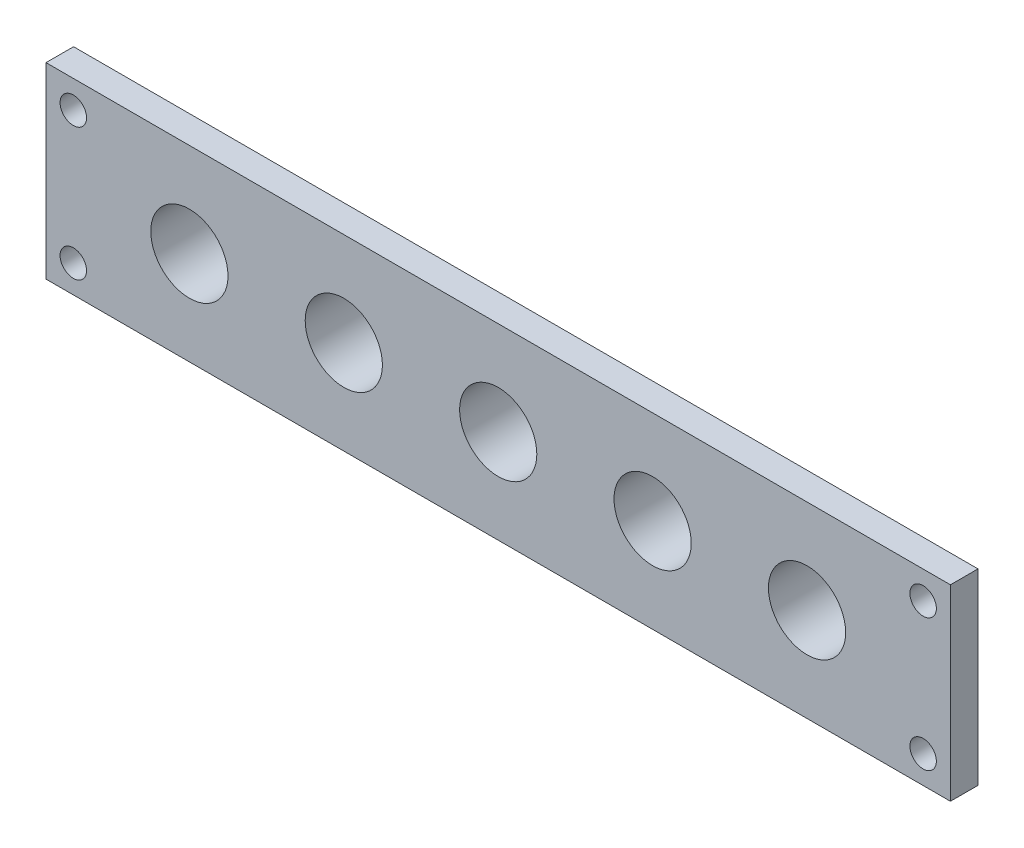
ISO-10303-21;
HEADER;
FILE_DESCRIPTION(('STEP AP214'),'2;1');
FILE_NAME('part.step','',(''),(''),'','','');
FILE_SCHEMA(('AUTOMOTIVE_DESIGN { 1 0 10303 214 1 1 1 1 }'));
ENDSEC;
DATA;
#1=APPLICATION_CONTEXT('core data for automotive mechanical design processes');
#2=APPLICATION_PROTOCOL_DEFINITION('international standard','automotive_design',2000,#1);
#3=PRODUCT_CONTEXT('',#1,'mechanical');
#4=PRODUCT('Part','Part','',(#3));
#5=PRODUCT_RELATED_PRODUCT_CATEGORY('part','',(#4));
#6=PRODUCT_DEFINITION_FORMATION('','',#4);
#7=PRODUCT_DEFINITION_CONTEXT('part definition',#1,'design');
#8=PRODUCT_DEFINITION('design','',#6,#7);
#9=PRODUCT_DEFINITION_SHAPE('','',#8);
#10=(LENGTH_UNIT() NAMED_UNIT(*) SI_UNIT(.MILLI.,.METRE.));
#11=(NAMED_UNIT(*) PLANE_ANGLE_UNIT() SI_UNIT($,.RADIAN.));
#12=(NAMED_UNIT(*) SI_UNIT($,.STERADIAN.) SOLID_ANGLE_UNIT());
#13=UNCERTAINTY_MEASURE_WITH_UNIT(LENGTH_MEASURE(1.E-05),#10,'distance_accuracy_value','');
#14=(GEOMETRIC_REPRESENTATION_CONTEXT(3) GLOBAL_UNCERTAINTY_ASSIGNED_CONTEXT((#13)) GLOBAL_UNIT_ASSIGNED_CONTEXT((#10,
#11,#12)) REPRESENTATION_CONTEXT('',''));
#15=CARTESIAN_POINT('',(0.,0.,0.));
#16=DIRECTION('',(0.,0.,1.));
#17=DIRECTION('',(1.,0.,0.));
#18=AXIS2_PLACEMENT_3D('',#15,#16,#17);
#19=CARTESIAN_POINT('',(36.5,4.2,3.));
#20=DIRECTION('',(-1.,0.,0.));
#21=DIRECTION('',(0.,-1.,0.));
#22=AXIS2_PLACEMENT_3D('',#19,#20,#21);
#23=PLANE('',#22);
#24=DIRECTION('',(0.,1.,0.));
#25=VECTOR('',#24,1.);
#26=CARTESIAN_POINT('',(36.5,4.2,0.));
#27=LINE('',#26,#25);
#28=CARTESIAN_POINT('',(36.5,-4.2,0.));
#29=VERTEX_POINT('',#28);
#30=CARTESIAN_POINT('',(36.5,4.2,0.));
#31=VERTEX_POINT('',#30);
#32=EDGE_CURVE('E135',#29,#31,#27,.T.);
#33=ORIENTED_EDGE('',*,*,#32,.T.);
#34=DIRECTION('',(0.,0.,-1.));
#35=VECTOR('',#34,1.);
#36=CARTESIAN_POINT('',(36.5,4.2,3.));
#37=LINE('',#36,#35);
#38=CARTESIAN_POINT('',(36.5,4.2,3.));
#39=VERTEX_POINT('',#38);
#40=EDGE_CURVE('E11',#39,#31,#37,.T.);
#41=ORIENTED_EDGE('',*,*,#40,.F.);
#42=DIRECTION('',(0.,1.,0.));
#43=VECTOR('',#42,1.);
#44=CARTESIAN_POINT('',(36.5,4.2,3.));
#45=LINE('',#44,#43);
#46=CARTESIAN_POINT('',(36.5,-4.2,3.));
#47=VERTEX_POINT('',#46);
#48=EDGE_CURVE('E144',#47,#39,#45,.T.);
#49=ORIENTED_EDGE('',*,*,#48,.F.);
#50=DIRECTION('',(0.,0.,-1.));
#51=VECTOR('',#50,1.);
#52=CARTESIAN_POINT('',(36.5,-4.2,3.));
#53=LINE('',#52,#51);
#54=EDGE_CURVE('E153',#47,#29,#53,.T.);
#55=ORIENTED_EDGE('',*,*,#54,.T.);
#56=EDGE_LOOP('',(#33,#41,#49,#55));
#57=FACE_BOUND('',#56,.T.);
#58=ADVANCED_FACE('F35',(#57),#23,.F.);
#59=CARTESIAN_POINT('',(-36.5,4.2,3.));
#60=DIRECTION('',(0.,-1.,0.));
#61=DIRECTION('',(0.,0.,-1.));
#62=AXIS2_PLACEMENT_3D('',#59,#60,#61);
#63=PLANE('',#62);
#64=DIRECTION('',(-1.,0.,0.));
#65=VECTOR('',#64,1.);
#66=CARTESIAN_POINT('',(-36.5,4.2,0.));
#67=LINE('',#66,#65);
#68=CARTESIAN_POINT('',(-36.5,4.2,0.));
#69=VERTEX_POINT('',#68);
#70=EDGE_CURVE('E138',#31,#69,#67,.T.);
#71=ORIENTED_EDGE('',*,*,#70,.T.);
#72=DIRECTION('',(0.,0.,-1.));
#73=VECTOR('',#72,1.);
#74=CARTESIAN_POINT('',(-36.5,4.2,3.));
#75=LINE('',#74,#73);
#76=CARTESIAN_POINT('',(-36.5,4.2,3.));
#77=VERTEX_POINT('',#76);
#78=EDGE_CURVE('E44',#77,#69,#75,.T.);
#79=ORIENTED_EDGE('',*,*,#78,.F.);
#80=DIRECTION('',(-1.,0.,0.));
#81=VECTOR('',#80,1.);
#82=CARTESIAN_POINT('',(-36.5,4.2,3.));
#83=LINE('',#82,#81);
#84=EDGE_CURVE('E79',#39,#77,#83,.T.);
#85=ORIENTED_EDGE('',*,*,#84,.F.);
#86=ORIENTED_EDGE('',*,*,#40,.T.);
#87=EDGE_LOOP('',(#71,#79,#85,#86));
#88=FACE_BOUND('',#87,.T.);
#89=ADVANCED_FACE('F224',(#88),#63,.F.);
#90=CARTESIAN_POINT('',(-36.5,4.2,3.));
#91=DIRECTION('',(1.,0.,0.));
#92=DIRECTION('',(0.,1.,0.));
#93=AXIS2_PLACEMENT_3D('',#90,#91,#92);
#94=PLANE('',#93);
#95=DIRECTION('',(0.,-1.,0.));
#96=VECTOR('',#95,1.);
#97=CARTESIAN_POINT('',(-36.5,4.2,0.));
#98=LINE('',#97,#96);
#99=CARTESIAN_POINT('',(-36.5,-4.2,0.));
#100=VERTEX_POINT('',#99);
#101=EDGE_CURVE('E69',#69,#100,#98,.T.);
#102=ORIENTED_EDGE('',*,*,#101,.T.);
#103=DIRECTION('',(0.,0.,-1.));
#104=VECTOR('',#103,1.);
#105=CARTESIAN_POINT('',(-36.5,-4.2,3.));
#106=LINE('',#105,#104);
#107=CARTESIAN_POINT('',(-36.5,-4.2,3.));
#108=VERTEX_POINT('',#107);
#109=EDGE_CURVE('E53',#108,#100,#106,.T.);
#110=ORIENTED_EDGE('',*,*,#109,.F.);
#111=DIRECTION('',(0.,-1.,0.));
#112=VECTOR('',#111,1.);
#113=CARTESIAN_POINT('',(-36.5,4.2,3.));
#114=LINE('',#113,#112);
#115=EDGE_CURVE('E148',#77,#108,#114,.T.);
#116=ORIENTED_EDGE('',*,*,#115,.F.);
#117=ORIENTED_EDGE('',*,*,#78,.T.);
#118=EDGE_LOOP('',(#102,#110,#116,#117));
#119=FACE_BOUND('',#118,.T.);
#120=ADVANCED_FACE('F229',(#119),#94,.F.);
#121=CARTESIAN_POINT('',(-36.5,-4.2,3.));
#122=DIRECTION('',(0.,1.,0.));
#123=DIRECTION('',(0.,0.,1.));
#124=AXIS2_PLACEMENT_3D('',#121,#122,#123);
#125=PLANE('',#124);
#126=DIRECTION('',(1.,0.,0.));
#127=VECTOR('',#126,1.);
#128=CARTESIAN_POINT('',(-36.5,-4.2,0.));
#129=LINE('',#128,#127);
#130=EDGE_CURVE('E74',#100,#29,#129,.T.);
#131=ORIENTED_EDGE('',*,*,#130,.T.);
#132=ORIENTED_EDGE('',*,*,#54,.F.);
#133=DIRECTION('',(1.,0.,0.));
#134=VECTOR('',#133,1.);
#135=CARTESIAN_POINT('',(-36.5,-4.2,3.));
#136=LINE('',#135,#134);
#137=EDGE_CURVE('E151',#108,#47,#136,.T.);
#138=ORIENTED_EDGE('',*,*,#137,.F.);
#139=ORIENTED_EDGE('',*,*,#109,.T.);
#140=EDGE_LOOP('',(#131,#132,#138,#139));
#141=FACE_BOUND('',#140,.T.);
#142=ADVANCED_FACE('F233',(#141),#125,.F.);
#143=CARTESIAN_POINT('',(0.,0.,0.));
#144=DIRECTION('',(0.,0.,1.));
#145=DIRECTION('',(1.,0.,0.));
#146=AXIS2_PLACEMENT_3D('',#143,#144,#145);
#147=PLANE('',#146);
#148=CARTESIAN_POINT('',(-14.,0.,0.));
#149=DIRECTION('',(0.,0.,-1.));
#150=DIRECTION('',(-1.,0.,0.));
#151=AXIS2_PLACEMENT_3D('',#148,#149,#150);
#152=CIRCLE('',#151,3.5);
#153=CARTESIAN_POINT('',(-17.5,0.,0.));
#154=VERTEX_POINT('',#153);
#155=EDGE_CURVE('E173',#154,#154,#152,.T.);
#156=ORIENTED_EDGE('',*,*,#155,.F.);
#157=EDGE_LOOP('',(#156));
#158=FACE_BOUND('',#157,.T.);
#159=CARTESIAN_POINT('',(-28.,0.,0.));
#160=DIRECTION('',(0.,0.,-1.));
#161=DIRECTION('',(-1.,0.,0.));
#162=AXIS2_PLACEMENT_3D('',#159,#160,#161);
#163=CIRCLE('',#162,3.5);
#164=CARTESIAN_POINT('',(-31.5,0.,0.));
#165=VERTEX_POINT('',#164);
#166=EDGE_CURVE('E179',#165,#165,#163,.T.);
#167=ORIENTED_EDGE('',*,*,#166,.F.);
#168=EDGE_LOOP('',(#167));
#169=FACE_BOUND('',#168,.T.);
#170=CARTESIAN_POINT('',(14.,0.,0.));
#171=DIRECTION('',(0.,0.,-1.));
#172=DIRECTION('',(-1.,0.,0.));
#173=AXIS2_PLACEMENT_3D('',#170,#171,#172);
#174=CIRCLE('',#173,3.5);
#175=CARTESIAN_POINT('',(10.5,0.,0.));
#176=VERTEX_POINT('',#175);
#177=EDGE_CURVE('E169',#176,#176,#174,.T.);
#178=ORIENTED_EDGE('',*,*,#177,.F.);
#179=EDGE_LOOP('',(#178));
#180=FACE_BOUND('',#179,.T.);
#181=CARTESIAN_POINT('',(28.,0.,0.));
#182=DIRECTION('',(0.,0.,-1.));
#183=DIRECTION('',(-1.,0.,0.));
#184=AXIS2_PLACEMENT_3D('',#181,#182,#183);
#185=CIRCLE('',#184,3.5);
#186=CARTESIAN_POINT('',(24.5,0.,0.));
#187=VERTEX_POINT('',#186);
#188=EDGE_CURVE('E177',#187,#187,#185,.T.);
#189=ORIENTED_EDGE('',*,*,#188,.F.);
#190=EDGE_LOOP('',(#189));
#191=FACE_BOUND('',#190,.T.);
#192=CARTESIAN_POINT('',(0.,0.,0.));
#193=DIRECTION('',(0.,0.,-1.));
#194=DIRECTION('',(-1.,0.,0.));
#195=AXIS2_PLACEMENT_3D('',#192,#193,#194);
#196=CIRCLE('',#195,3.5);
#197=CARTESIAN_POINT('',(-3.5,0.,0.));
#198=VERTEX_POINT('',#197);
#199=EDGE_CURVE('E164',#198,#198,#196,.T.);
#200=ORIENTED_EDGE('',*,*,#199,.F.);
#201=EDGE_LOOP('',(#200));
#202=FACE_BOUND('',#201,.T.);
#203=ORIENTED_EDGE('',*,*,#32,.F.);
#204=ORIENTED_EDGE('',*,*,#130,.F.);
#205=ORIENTED_EDGE('',*,*,#101,.F.);
#206=ORIENTED_EDGE('',*,*,#70,.F.);
#207=EDGE_LOOP('',(#203,#204,#205,#206));
#208=FACE_BOUND('',#207,.T.);
#209=ADVANCED_FACE('F232',(#158,#169,#180,#191,#202,#208),#147,.F.);
#210=CARTESIAN_POINT('',(0.,0.,3.));
#211=DIRECTION('',(0.,0.,1.));
#212=DIRECTION('',(1.,0.,0.));
#213=AXIS2_PLACEMENT_3D('',#210,#211,#212);
#214=PLANE('',#213);
#215=CARTESIAN_POINT('',(38.524276054942,5.99893177598476,3.));
#216=DIRECTION('',(0.,0.,1.));
#217=DIRECTION('',(1.,0.,0.));
#218=AXIS2_PLACEMENT_3D('',#215,#216,#217);
#219=CIRCLE('',#218,1.2);
#220=CARTESIAN_POINT('',(39.724276054942,5.99893177598476,3.));
#221=VERTEX_POINT('',#220);
#222=EDGE_CURVE('E184',#221,#221,#219,.T.);
#223=ORIENTED_EDGE('',*,*,#222,.T.);
#224=EDGE_LOOP('',(#223));
#225=FACE_BOUND('',#224,.T.);
#226=CARTESIAN_POINT('',(38.524276054942,-5.99893177598476,3.));
#227=DIRECTION('',(0.,0.,1.));
#228=DIRECTION('',(1.,0.,0.));
#229=AXIS2_PLACEMENT_3D('',#226,#227,#228);
#230=CIRCLE('',#229,1.2);
#231=CARTESIAN_POINT('',(39.724276054942,-5.99893177598476,3.));
#232=VERTEX_POINT('',#231);
#233=EDGE_CURVE('E302',#232,#232,#230,.T.);
#234=ORIENTED_EDGE('',*,*,#233,.T.);
#235=EDGE_LOOP('',(#234));
#236=FACE_BOUND('',#235,.T.);
#237=CARTESIAN_POINT('',(-38.524276054942,-5.99893177598476,3.));
#238=DIRECTION('',(0.,0.,1.));
#239=DIRECTION('',(1.,0.,0.));
#240=AXIS2_PLACEMENT_3D('',#237,#238,#239);
#241=CIRCLE('',#240,1.2);
#242=CARTESIAN_POINT('',(-37.3242760549419,-5.99893177598476,3.));
#243=VERTEX_POINT('',#242);
#244=EDGE_CURVE('E300',#243,#243,#241,.T.);
#245=ORIENTED_EDGE('',*,*,#244,.T.);
#246=EDGE_LOOP('',(#245));
#247=FACE_BOUND('',#246,.T.);
#248=CARTESIAN_POINT('',(-38.524276054942,5.99893177598476,3.));
#249=DIRECTION('',(0.,0.,1.));
#250=DIRECTION('',(1.,0.,0.));
#251=AXIS2_PLACEMENT_3D('',#248,#249,#250);
#252=CIRCLE('',#251,1.2);
#253=CARTESIAN_POINT('',(-37.3242760549419,5.99893177598476,3.));
#254=VERTEX_POINT('',#253);
#255=EDGE_CURVE('E303',#254,#254,#252,.T.);
#256=ORIENTED_EDGE('',*,*,#255,.T.);
#257=EDGE_LOOP('',(#256));
#258=FACE_BOUND('',#257,.T.);
#259=DIRECTION('',(0.,1.,0.));
#260=VECTOR('',#259,1.);
#261=CARTESIAN_POINT('',(41.,8.5,3.));
#262=LINE('',#261,#260);
#263=CARTESIAN_POINT('',(41.,-8.5,3.));
#264=VERTEX_POINT('',#263);
#265=CARTESIAN_POINT('',(41.,8.5,3.));
#266=VERTEX_POINT('',#265);
#267=EDGE_CURVE('E134',#264,#266,#262,.T.);
#268=ORIENTED_EDGE('',*,*,#267,.F.);
#269=DIRECTION('',(1.,0.,0.));
#270=VECTOR('',#269,1.);
#271=CARTESIAN_POINT('',(-41.,-8.5,3.));
#272=LINE('',#271,#270);
#273=CARTESIAN_POINT('',(-41.,-8.5,3.));
#274=VERTEX_POINT('',#273);
#275=EDGE_CURVE('E130',#274,#264,#272,.T.);
#276=ORIENTED_EDGE('',*,*,#275,.F.);
#277=DIRECTION('',(0.,-1.,0.));
#278=VECTOR('',#277,1.);
#279=CARTESIAN_POINT('',(-41.,8.5,3.));
#280=LINE('',#279,#278);
#281=CARTESIAN_POINT('',(-41.,8.5,3.));
#282=VERTEX_POINT('',#281);
#283=EDGE_CURVE('E201',#282,#274,#280,.T.);
#284=ORIENTED_EDGE('',*,*,#283,.F.);
#285=DIRECTION('',(-1.,0.,0.));
#286=VECTOR('',#285,1.);
#287=CARTESIAN_POINT('',(-41.,8.5,3.));
#288=LINE('',#287,#286);
#289=EDGE_CURVE('E199',#266,#282,#288,.T.);
#290=ORIENTED_EDGE('',*,*,#289,.F.);
#291=EDGE_LOOP('',(#268,#276,#284,#290));
#292=FACE_BOUND('',#291,.T.);
#293=ORIENTED_EDGE('',*,*,#137,.T.);
#294=ORIENTED_EDGE('',*,*,#48,.T.);
#295=ORIENTED_EDGE('',*,*,#84,.T.);
#296=ORIENTED_EDGE('',*,*,#115,.T.);
#297=EDGE_LOOP('',(#293,#294,#295,#296));
#298=FACE_BOUND('',#297,.T.);
#299=ADVANCED_FACE('F212',(#225,#236,#247,#258,#292,#298),#214,.F.);
#300=CARTESIAN_POINT('',(41.,8.5,5.5));
#301=DIRECTION('',(-1.,0.,0.));
#302=DIRECTION('',(0.,0.,1.));
#303=AXIS2_PLACEMENT_3D('',#300,#301,#302);
#304=PLANE('',#303);
#305=ORIENTED_EDGE('',*,*,#267,.T.);
#306=DIRECTION('',(0.,0.,-1.));
#307=VECTOR('',#306,1.);
#308=CARTESIAN_POINT('',(41.,8.5,5.5));
#309=LINE('',#308,#307);
#310=CARTESIAN_POINT('',(41.,8.5,5.5));
#311=VERTEX_POINT('',#310);
#312=EDGE_CURVE('E114',#311,#266,#309,.T.);
#313=ORIENTED_EDGE('',*,*,#312,.F.);
#314=DIRECTION('',(0.,1.,0.));
#315=VECTOR('',#314,1.);
#316=CARTESIAN_POINT('',(41.,8.5,5.5));
#317=LINE('',#316,#315);
#318=CARTESIAN_POINT('',(41.,-8.5,5.5));
#319=VERTEX_POINT('',#318);
#320=EDGE_CURVE('E121',#319,#311,#317,.T.);
#321=ORIENTED_EDGE('',*,*,#320,.F.);
#322=DIRECTION('',(0.,0.,-1.));
#323=VECTOR('',#322,1.);
#324=CARTESIAN_POINT('',(41.,-8.5,5.5));
#325=LINE('',#324,#323);
#326=EDGE_CURVE('E197',#319,#264,#325,.T.);
#327=ORIENTED_EDGE('',*,*,#326,.T.);
#328=EDGE_LOOP('',(#305,#313,#321,#327));
#329=FACE_BOUND('',#328,.T.);
#330=ADVANCED_FACE('F132',(#329),#304,.F.);
#331=CARTESIAN_POINT('',(-41.,8.5,5.5));
#332=DIRECTION('',(0.,-1.,0.));
#333=DIRECTION('',(0.,0.,-1.));
#334=AXIS2_PLACEMENT_3D('',#331,#332,#333);
#335=PLANE('',#334);
#336=ORIENTED_EDGE('',*,*,#289,.T.);
#337=DIRECTION('',(0.,0.,-1.));
#338=VECTOR('',#337,1.);
#339=CARTESIAN_POINT('',(-41.,8.5,5.5));
#340=LINE('',#339,#338);
#341=CARTESIAN_POINT('',(-41.,8.5,5.5));
#342=VERTEX_POINT('',#341);
#343=EDGE_CURVE('E117',#342,#282,#340,.T.);
#344=ORIENTED_EDGE('',*,*,#343,.F.);
#345=DIRECTION('',(-1.,0.,0.));
#346=VECTOR('',#345,1.);
#347=CARTESIAN_POINT('',(-41.,8.5,5.5));
#348=LINE('',#347,#346);
#349=EDGE_CURVE('E110',#311,#342,#348,.T.);
#350=ORIENTED_EDGE('',*,*,#349,.F.);
#351=ORIENTED_EDGE('',*,*,#312,.T.);
#352=EDGE_LOOP('',(#336,#344,#350,#351));
#353=FACE_BOUND('',#352,.T.);
#354=ADVANCED_FACE('F112',(#353),#335,.F.);
#355=CARTESIAN_POINT('',(-41.,8.5,5.5));
#356=DIRECTION('',(1.,0.,0.));
#357=DIRECTION('',(0.,0.,-1.));
#358=AXIS2_PLACEMENT_3D('',#355,#356,#357);
#359=PLANE('',#358);
#360=ORIENTED_EDGE('',*,*,#283,.T.);
#361=DIRECTION('',(0.,0.,-1.));
#362=VECTOR('',#361,1.);
#363=CARTESIAN_POINT('',(-41.,-8.5,5.5));
#364=LINE('',#363,#362);
#365=CARTESIAN_POINT('',(-41.,-8.5,5.5));
#366=VERTEX_POINT('',#365);
#367=EDGE_CURVE('E140',#366,#274,#364,.T.);
#368=ORIENTED_EDGE('',*,*,#367,.F.);
#369=DIRECTION('',(0.,-1.,0.));
#370=VECTOR('',#369,1.);
#371=CARTESIAN_POINT('',(-41.,8.5,5.5));
#372=LINE('',#371,#370);
#373=EDGE_CURVE('E120',#342,#366,#372,.T.);
#374=ORIENTED_EDGE('',*,*,#373,.F.);
#375=ORIENTED_EDGE('',*,*,#343,.T.);
#376=EDGE_LOOP('',(#360,#368,#374,#375));
#377=FACE_BOUND('',#376,.T.);
#378=ADVANCED_FACE('F214',(#377),#359,.F.);
#379=CARTESIAN_POINT('',(-41.,-8.5,5.5));
#380=DIRECTION('',(0.,1.,0.));
#381=DIRECTION('',(0.,0.,1.));
#382=AXIS2_PLACEMENT_3D('',#379,#380,#381);
#383=PLANE('',#382);
#384=ORIENTED_EDGE('',*,*,#275,.T.);
#385=ORIENTED_EDGE('',*,*,#326,.F.);
#386=DIRECTION('',(1.,0.,0.));
#387=VECTOR('',#386,1.);
#388=CARTESIAN_POINT('',(-41.,-8.5,5.5));
#389=LINE('',#388,#387);
#390=EDGE_CURVE('E126',#366,#319,#389,.T.);
#391=ORIENTED_EDGE('',*,*,#390,.F.);
#392=ORIENTED_EDGE('',*,*,#367,.T.);
#393=EDGE_LOOP('',(#384,#385,#391,#392));
#394=FACE_BOUND('',#393,.T.);
#395=ADVANCED_FACE('F208',(#394),#383,.F.);
#396=CARTESIAN_POINT('',(0.,0.,5.5));
#397=DIRECTION('',(0.,0.,1.));
#398=DIRECTION('',(1.,0.,0.));
#399=AXIS2_PLACEMENT_3D('',#396,#397,#398);
#400=PLANE('',#399);
#401=CARTESIAN_POINT('',(38.524276054942,5.99893177598476,5.5));
#402=DIRECTION('',(0.,0.,1.));
#403=DIRECTION('',(1.,0.,0.));
#404=AXIS2_PLACEMENT_3D('',#401,#402,#403);
#405=CIRCLE('',#404,1.2);
#406=CARTESIAN_POINT('',(39.724276054942,5.99893177598476,5.5));
#407=VERTEX_POINT('',#406);
#408=EDGE_CURVE('E312',#407,#407,#405,.T.);
#409=ORIENTED_EDGE('',*,*,#408,.F.);
#410=EDGE_LOOP('',(#409));
#411=FACE_BOUND('',#410,.T.);
#412=CARTESIAN_POINT('',(38.524276054942,-5.99893177598476,5.5));
#413=DIRECTION('',(0.,0.,1.));
#414=DIRECTION('',(1.,0.,0.));
#415=AXIS2_PLACEMENT_3D('',#412,#413,#414);
#416=CIRCLE('',#415,1.2);
#417=CARTESIAN_POINT('',(39.724276054942,-5.99893177598476,5.5));
#418=VERTEX_POINT('',#417);
#419=EDGE_CURVE('E315',#418,#418,#416,.T.);
#420=ORIENTED_EDGE('',*,*,#419,.F.);
#421=EDGE_LOOP('',(#420));
#422=FACE_BOUND('',#421,.T.);
#423=CARTESIAN_POINT('',(-38.524276054942,-5.99893177598476,5.5));
#424=DIRECTION('',(0.,0.,1.));
#425=DIRECTION('',(1.,0.,0.));
#426=AXIS2_PLACEMENT_3D('',#423,#424,#425);
#427=CIRCLE('',#426,1.2);
#428=CARTESIAN_POINT('',(-37.3242760549419,-5.99893177598476,5.5));
#429=VERTEX_POINT('',#428);
#430=EDGE_CURVE('E297',#429,#429,#427,.T.);
#431=ORIENTED_EDGE('',*,*,#430,.F.);
#432=EDGE_LOOP('',(#431));
#433=FACE_BOUND('',#432,.T.);
#434=CARTESIAN_POINT('',(-38.524276054942,5.99893177598476,5.5));
#435=DIRECTION('',(0.,0.,1.));
#436=DIRECTION('',(1.,0.,0.));
#437=AXIS2_PLACEMENT_3D('',#434,#435,#436);
#438=CIRCLE('',#437,1.2);
#439=CARTESIAN_POINT('',(-37.3242760549419,5.99893177598476,5.5));
#440=VERTEX_POINT('',#439);
#441=EDGE_CURVE('E307',#440,#440,#438,.T.);
#442=ORIENTED_EDGE('',*,*,#441,.F.);
#443=EDGE_LOOP('',(#442));
#444=FACE_BOUND('',#443,.T.);
#445=CARTESIAN_POINT('',(-14.,0.,5.5));
#446=DIRECTION('',(0.,0.,1.));
#447=DIRECTION('',(1.,0.,0.));
#448=AXIS2_PLACEMENT_3D('',#445,#446,#447);
#449=CIRCLE('',#448,3.5);
#450=CARTESIAN_POINT('',(-10.5,0.,5.5));
#451=VERTEX_POINT('',#450);
#452=EDGE_CURVE('E38',#451,#451,#449,.T.);
#453=ORIENTED_EDGE('',*,*,#452,.F.);
#454=EDGE_LOOP('',(#453));
#455=FACE_BOUND('',#454,.T.);
#456=CARTESIAN_POINT('',(-28.,0.,5.5));
#457=DIRECTION('',(0.,0.,1.));
#458=DIRECTION('',(1.,0.,0.));
#459=AXIS2_PLACEMENT_3D('',#456,#457,#458);
#460=CIRCLE('',#459,3.5);
#461=CARTESIAN_POINT('',(-24.5,0.,5.5));
#462=VERTEX_POINT('',#461);
#463=EDGE_CURVE('E171',#462,#462,#460,.T.);
#464=ORIENTED_EDGE('',*,*,#463,.F.);
#465=EDGE_LOOP('',(#464));
#466=FACE_BOUND('',#465,.T.);
#467=CARTESIAN_POINT('',(14.,0.,5.5));
#468=DIRECTION('',(0.,0.,1.));
#469=DIRECTION('',(1.,0.,0.));
#470=AXIS2_PLACEMENT_3D('',#467,#468,#469);
#471=CIRCLE('',#470,3.5);
#472=CARTESIAN_POINT('',(17.5,0.,5.5));
#473=VERTEX_POINT('',#472);
#474=EDGE_CURVE('E168',#473,#473,#471,.T.);
#475=ORIENTED_EDGE('',*,*,#474,.F.);
#476=EDGE_LOOP('',(#475));
#477=FACE_BOUND('',#476,.T.);
#478=CARTESIAN_POINT('',(28.,0.,5.5));
#479=DIRECTION('',(0.,0.,1.));
#480=DIRECTION('',(1.,0.,0.));
#481=AXIS2_PLACEMENT_3D('',#478,#479,#480);
#482=CIRCLE('',#481,3.5);
#483=CARTESIAN_POINT('',(31.5,0.,5.5));
#484=VERTEX_POINT('',#483);
#485=EDGE_CURVE('E165',#484,#484,#482,.T.);
#486=ORIENTED_EDGE('',*,*,#485,.F.);
#487=EDGE_LOOP('',(#486));
#488=FACE_BOUND('',#487,.T.);
#489=CARTESIAN_POINT('',(0.,0.,5.5));
#490=DIRECTION('',(0.,0.,1.));
#491=DIRECTION('',(1.,0.,0.));
#492=AXIS2_PLACEMENT_3D('',#489,#490,#491);
#493=CIRCLE('',#492,3.5);
#494=CARTESIAN_POINT('',(3.5,0.,5.5));
#495=VERTEX_POINT('',#494);
#496=EDGE_CURVE('E161',#495,#495,#493,.T.);
#497=ORIENTED_EDGE('',*,*,#496,.F.);
#498=EDGE_LOOP('',(#497));
#499=FACE_BOUND('',#498,.T.);
#500=ORIENTED_EDGE('',*,*,#320,.T.);
#501=ORIENTED_EDGE('',*,*,#349,.T.);
#502=ORIENTED_EDGE('',*,*,#373,.T.);
#503=ORIENTED_EDGE('',*,*,#390,.T.);
#504=EDGE_LOOP('',(#500,#501,#502,#503));
#505=FACE_BOUND('',#504,.T.);
#506=ADVANCED_FACE('F124',(#411,#422,#433,#444,#455,#466,#477,#488,#499,#505),#400,.T.);
#507=CARTESIAN_POINT('',(0.,0.,10.));
#508=DIRECTION('',(0.,0.,-1.));
#509=DIRECTION('',(-1.,0.,0.));
#510=AXIS2_PLACEMENT_3D('',#507,#508,#509);
#511=CYLINDRICAL_SURFACE('',#510,3.5);
#512=ORIENTED_EDGE('',*,*,#496,.T.);
#513=EDGE_LOOP('',(#512));
#514=FACE_BOUND('',#513,.T.);
#515=ORIENTED_EDGE('',*,*,#199,.T.);
#516=EDGE_LOOP('',(#515));
#517=FACE_BOUND('',#516,.T.);
#518=ADVANCED_FACE('F257',(#514,#517),#511,.F.);
#519=CARTESIAN_POINT('',(28.,0.,10.));
#520=DIRECTION('',(0.,0.,-1.));
#521=DIRECTION('',(-1.,0.,0.));
#522=AXIS2_PLACEMENT_3D('',#519,#520,#521);
#523=CYLINDRICAL_SURFACE('',#522,3.5);
#524=ORIENTED_EDGE('',*,*,#485,.T.);
#525=EDGE_LOOP('',(#524));
#526=FACE_BOUND('',#525,.T.);
#527=ORIENTED_EDGE('',*,*,#188,.T.);
#528=EDGE_LOOP('',(#527));
#529=FACE_BOUND('',#528,.T.);
#530=ADVANCED_FACE('F261',(#526,#529),#523,.F.);
#531=CARTESIAN_POINT('',(14.,0.,10.));
#532=DIRECTION('',(0.,0.,-1.));
#533=DIRECTION('',(-1.,0.,0.));
#534=AXIS2_PLACEMENT_3D('',#531,#532,#533);
#535=CYLINDRICAL_SURFACE('',#534,3.5);
#536=ORIENTED_EDGE('',*,*,#474,.T.);
#537=EDGE_LOOP('',(#536));
#538=FACE_BOUND('',#537,.T.);
#539=ORIENTED_EDGE('',*,*,#177,.T.);
#540=EDGE_LOOP('',(#539));
#541=FACE_BOUND('',#540,.T.);
#542=ADVANCED_FACE('F265',(#538,#541),#535,.F.);
#543=CARTESIAN_POINT('',(-28.,0.,10.));
#544=DIRECTION('',(0.,0.,-1.));
#545=DIRECTION('',(-1.,0.,0.));
#546=AXIS2_PLACEMENT_3D('',#543,#544,#545);
#547=CYLINDRICAL_SURFACE('',#546,3.5);
#548=ORIENTED_EDGE('',*,*,#463,.T.);
#549=EDGE_LOOP('',(#548));
#550=FACE_BOUND('',#549,.T.);
#551=ORIENTED_EDGE('',*,*,#166,.T.);
#552=EDGE_LOOP('',(#551));
#553=FACE_BOUND('',#552,.T.);
#554=ADVANCED_FACE('F269',(#550,#553),#547,.F.);
#555=CARTESIAN_POINT('',(-14.,0.,10.));
#556=DIRECTION('',(0.,0.,-1.));
#557=DIRECTION('',(-1.,0.,0.));
#558=AXIS2_PLACEMENT_3D('',#555,#556,#557);
#559=CYLINDRICAL_SURFACE('',#558,3.5);
#560=ORIENTED_EDGE('',*,*,#452,.T.);
#561=EDGE_LOOP('',(#560));
#562=FACE_BOUND('',#561,.T.);
#563=ORIENTED_EDGE('',*,*,#155,.T.);
#564=EDGE_LOOP('',(#563));
#565=FACE_BOUND('',#564,.T.);
#566=ADVANCED_FACE('F273',(#562,#565),#559,.F.);
#567=CARTESIAN_POINT('',(-38.524276054942,5.99893177598476,-0.5));
#568=DIRECTION('',(0.,0.,1.));
#569=DIRECTION('',(1.,0.,0.));
#570=AXIS2_PLACEMENT_3D('',#567,#568,#569);
#571=CYLINDRICAL_SURFACE('',#570,1.2);
#572=ORIENTED_EDGE('',*,*,#441,.T.);
#573=EDGE_LOOP('',(#572));
#574=FACE_BOUND('',#573,.T.);
#575=ORIENTED_EDGE('',*,*,#255,.F.);
#576=EDGE_LOOP('',(#575));
#577=FACE_BOUND('',#576,.T.);
#578=ADVANCED_FACE('F276',(#574,#577),#571,.F.);
#579=CARTESIAN_POINT('',(-38.524276054942,-5.99893177598476,-0.5));
#580=DIRECTION('',(0.,0.,1.));
#581=DIRECTION('',(1.,0.,0.));
#582=AXIS2_PLACEMENT_3D('',#579,#580,#581);
#583=CYLINDRICAL_SURFACE('',#582,1.2);
#584=ORIENTED_EDGE('',*,*,#430,.T.);
#585=EDGE_LOOP('',(#584));
#586=FACE_BOUND('',#585,.T.);
#587=ORIENTED_EDGE('',*,*,#244,.F.);
#588=EDGE_LOOP('',(#587));
#589=FACE_BOUND('',#588,.T.);
#590=ADVANCED_FACE('F280',(#586,#589),#583,.F.);
#591=CARTESIAN_POINT('',(38.524276054942,-5.99893177598476,-0.5));
#592=DIRECTION('',(0.,0.,1.));
#593=DIRECTION('',(1.,0.,0.));
#594=AXIS2_PLACEMENT_3D('',#591,#592,#593);
#595=CYLINDRICAL_SURFACE('',#594,1.2);
#596=ORIENTED_EDGE('',*,*,#419,.T.);
#597=EDGE_LOOP('',(#596));
#598=FACE_BOUND('',#597,.T.);
#599=ORIENTED_EDGE('',*,*,#233,.F.);
#600=EDGE_LOOP('',(#599));
#601=FACE_BOUND('',#600,.T.);
#602=ADVANCED_FACE('F285',(#598,#601),#595,.F.);
#603=CARTESIAN_POINT('',(38.524276054942,5.99893177598476,-0.5));
#604=DIRECTION('',(0.,0.,1.));
#605=DIRECTION('',(1.,0.,0.));
#606=AXIS2_PLACEMENT_3D('',#603,#604,#605);
#607=CYLINDRICAL_SURFACE('',#606,1.2);
#608=ORIENTED_EDGE('',*,*,#408,.T.);
#609=EDGE_LOOP('',(#608));
#610=FACE_BOUND('',#609,.T.);
#611=ORIENTED_EDGE('',*,*,#222,.F.);
#612=EDGE_LOOP('',(#611));
#613=FACE_BOUND('',#612,.T.);
#614=ADVANCED_FACE('F282',(#610,#613),#607,.F.);
#615=CLOSED_SHELL('',(#58,#89,#120,#142,#209,#299,#330,#354,#378,#395,#506,#518,#530,#542,#554,
#566,#578,#590,#602,#614));
#616=MANIFOLD_SOLID_BREP('B2',#615);
#617=ADVANCED_BREP_SHAPE_REPRESENTATION('',(#18,#616),#14);
#618=SHAPE_DEFINITION_REPRESENTATION(#9,#617);
ENDSEC;
END-ISO-10303-21;
